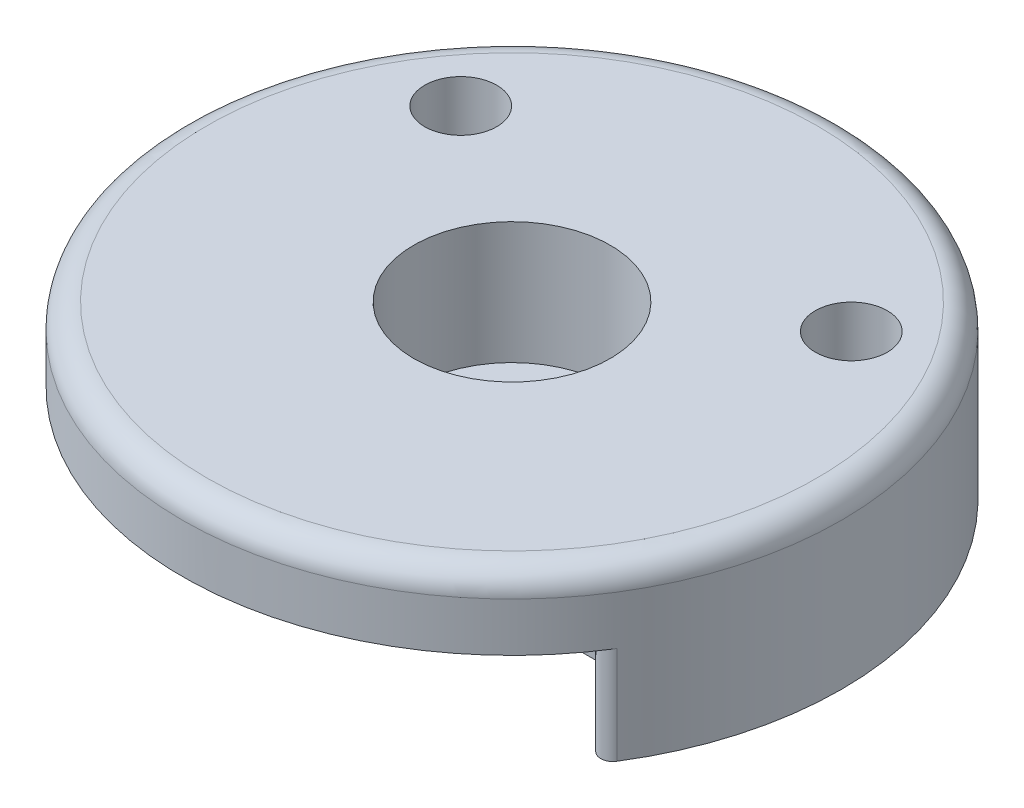
ISO-10303-21;
HEADER;
FILE_DESCRIPTION(('STEP AP214'),'2;1');
FILE_NAME('part.step','',(''),(''),'','','');
FILE_SCHEMA(('AUTOMOTIVE_DESIGN { 1 0 10303 214 1 1 1 1 }'));
ENDSEC;
DATA;
#1=APPLICATION_CONTEXT('core data for automotive mechanical design processes');
#2=APPLICATION_PROTOCOL_DEFINITION('international standard','automotive_design',2000,#1);
#3=PRODUCT_CONTEXT('',#1,'mechanical');
#4=PRODUCT('Part','Part','',(#3));
#5=PRODUCT_RELATED_PRODUCT_CATEGORY('part','',(#4));
#6=PRODUCT_DEFINITION_FORMATION('','',#4);
#7=PRODUCT_DEFINITION_CONTEXT('part definition',#1,'design');
#8=PRODUCT_DEFINITION('design','',#6,#7);
#9=PRODUCT_DEFINITION_SHAPE('','',#8);
#10=(LENGTH_UNIT() NAMED_UNIT(*) SI_UNIT(.MILLI.,.METRE.));
#11=(NAMED_UNIT(*) PLANE_ANGLE_UNIT() SI_UNIT($,.RADIAN.));
#12=(NAMED_UNIT(*) SI_UNIT($,.STERADIAN.) SOLID_ANGLE_UNIT());
#13=UNCERTAINTY_MEASURE_WITH_UNIT(LENGTH_MEASURE(1.E-05),#10,'distance_accuracy_value','');
#14=(GEOMETRIC_REPRESENTATION_CONTEXT(3) GLOBAL_UNCERTAINTY_ASSIGNED_CONTEXT((#13)) GLOBAL_UNIT_ASSIGNED_CONTEXT((#10,
#11,#12)) REPRESENTATION_CONTEXT('',''));
#15=CARTESIAN_POINT('',(0.,0.,0.));
#16=DIRECTION('',(0.,0.,1.));
#17=DIRECTION('',(1.,0.,0.));
#18=AXIS2_PLACEMENT_3D('',#15,#16,#17);
#19=CARTESIAN_POINT('',(0.,7.,0.));
#20=DIRECTION('',(0.,-1.,0.));
#21=DIRECTION('',(0.,0.,-1.));
#22=AXIS2_PLACEMENT_3D('',#19,#20,#21);
#23=CYLINDRICAL_SURFACE('',#22,13.5);
#24=CARTESIAN_POINT('',(0.,6.,0.));
#25=DIRECTION('',(0.,1.,0.));
#26=DIRECTION('',(0.,0.,1.));
#27=AXIS2_PLACEMENT_3D('',#24,#25,#26);
#28=CIRCLE('',#27,13.5);
#29=CARTESIAN_POINT('',(0.,6.,13.5));
#30=VERTEX_POINT('',#29);
#31=EDGE_CURVE('E191',#30,#30,#28,.F.);
#32=ORIENTED_EDGE('',*,*,#31,.T.);
#33=EDGE_LOOP('',(#32));
#34=FACE_BOUND('',#33,.T.);
#35=CARTESIAN_POINT('',(0.,4.,0.));
#36=DIRECTION('',(0.,-1.,0.));
#37=DIRECTION('',(0.,0.,-1.));
#38=AXIS2_PLACEMENT_3D('',#35,#36,#37);
#39=CIRCLE('',#38,13.5);
#40=CARTESIAN_POINT('',(11.4490384615385,4.,7.15328723778188));
#41=VERTEX_POINT('',#40);
#42=CARTESIAN_POINT('',(-11.4490384615385,4.,7.15328723778187));
#43=VERTEX_POINT('',#42);
#44=EDGE_CURVE('E198',#41,#43,#39,.T.);
#45=ORIENTED_EDGE('',*,*,#44,.F.);
#46=DIRECTION('',(0.,-1.,0.));
#47=VECTOR('',#46,1.);
#48=CARTESIAN_POINT('',(11.4490384615385,7.,7.15328723778188));
#49=LINE('',#48,#47);
#50=CARTESIAN_POINT('',(11.4490384615385,0.,7.15328723778188));
#51=VERTEX_POINT('',#50);
#52=EDGE_CURVE('E209',#41,#51,#49,.T.);
#53=ORIENTED_EDGE('',*,*,#52,.T.);
#54=CARTESIAN_POINT('',(0.,0.,0.));
#55=DIRECTION('',(0.,1.,0.));
#56=DIRECTION('',(0.,0.,1.));
#57=AXIS2_PLACEMENT_3D('',#54,#55,#56);
#58=CIRCLE('',#57,13.5);
#59=CARTESIAN_POINT('',(-11.4490384615385,0.,7.15328723778187));
#60=VERTEX_POINT('',#59);
#61=EDGE_CURVE('E180',#51,#60,#58,.T.);
#62=ORIENTED_EDGE('',*,*,#61,.T.);
#63=DIRECTION('',(0.,-1.,0.));
#64=VECTOR('',#63,1.);
#65=CARTESIAN_POINT('',(-11.4490384615385,7.,7.15328723778187));
#66=LINE('',#65,#64);
#67=EDGE_CURVE('E205',#60,#43,#66,.F.);
#68=ORIENTED_EDGE('',*,*,#67,.T.);
#69=EDGE_LOOP('',(#45,#53,#62,#68));
#70=FACE_BOUND('',#69,.T.);
#71=ADVANCED_FACE('F39',(#34,#70),#23,.T.);
#72=CARTESIAN_POINT('',(0.,0.,0.));
#73=DIRECTION('',(0.,1.,0.));
#74=DIRECTION('',(0.,0.,1.));
#75=AXIS2_PLACEMENT_3D('',#72,#73,#74);
#76=PLANE('',#75);
#77=ORIENTED_EDGE('',*,*,#61,.F.);
#78=CARTESIAN_POINT('',(11.025,0.,6.88835067341958));
#79=DIRECTION('',(0.,1.,0.));
#80=DIRECTION('',(0.,0.,1.));
#81=AXIS2_PLACEMENT_3D('',#78,#79,#80);
#82=CIRCLE('',#81,0.5);
#83=CARTESIAN_POINT('',(10.525,0.,6.88835067341958));
#84=VERTEX_POINT('',#83);
#85=EDGE_CURVE('E214',#51,#84,#82,.F.);
#86=ORIENTED_EDGE('',*,*,#85,.T.);
#87=DIRECTION('',(0.,0.,1.));
#88=VECTOR('',#87,1.);
#89=CARTESIAN_POINT('',(10.525,0.,7.85));
#90=LINE('',#89,#88);
#91=CARTESIAN_POINT('',(10.525,0.,-7.85));
#92=VERTEX_POINT('',#91);
#93=EDGE_CURVE('E141',#92,#84,#90,.T.);
#94=ORIENTED_EDGE('',*,*,#93,.F.);
#95=DIRECTION('',(1.,0.,0.));
#96=VECTOR('',#95,1.);
#97=CARTESIAN_POINT('',(-10.525,0.,-7.85));
#98=LINE('',#97,#96);
#99=CARTESIAN_POINT('',(-10.525,0.,-7.85));
#100=VERTEX_POINT('',#99);
#101=EDGE_CURVE('E152',#100,#92,#98,.T.);
#102=ORIENTED_EDGE('',*,*,#101,.F.);
#103=DIRECTION('',(0.,0.,-1.));
#104=VECTOR('',#103,1.);
#105=CARTESIAN_POINT('',(-10.525,0.,7.85));
#106=LINE('',#105,#104);
#107=CARTESIAN_POINT('',(-10.525,0.,6.88835067341958));
#108=VERTEX_POINT('',#107);
#109=EDGE_CURVE('E163',#108,#100,#106,.T.);
#110=ORIENTED_EDGE('',*,*,#109,.F.);
#111=CARTESIAN_POINT('',(-11.025,0.,6.88835067341958));
#112=DIRECTION('',(0.,1.,0.));
#113=DIRECTION('',(0.,0.,1.));
#114=AXIS2_PLACEMENT_3D('',#111,#112,#113);
#115=CIRCLE('',#114,0.5);
#116=EDGE_CURVE('E61',#108,#60,#115,.F.);
#117=ORIENTED_EDGE('',*,*,#116,.T.);
#118=EDGE_LOOP('',(#77,#86,#94,#102,#110,#117));
#119=FACE_BOUND('',#118,.T.);
#120=ADVANCED_FACE('F229',(#119),#76,.F.);
#121=CARTESIAN_POINT('',(0.,1.,0.));
#122=DIRECTION('',(0.,-1.,0.));
#123=DIRECTION('',(0.,0.,-1.));
#124=AXIS2_PLACEMENT_3D('',#121,#122,#123);
#125=PLANE('',#124);
#126=CARTESIAN_POINT('',(-8.,1.,-5.9));
#127=DIRECTION('',(0.,-1.,0.));
#128=DIRECTION('',(0.,0.,-1.));
#129=AXIS2_PLACEMENT_3D('',#126,#127,#128);
#130=CIRCLE('',#129,1.475);
#131=CARTESIAN_POINT('',(-8.,1.,-7.375));
#132=VERTEX_POINT('',#131);
#133=EDGE_CURVE('E132',#132,#132,#130,.T.);
#134=ORIENTED_EDGE('',*,*,#133,.F.);
#135=EDGE_LOOP('',(#134));
#136=FACE_BOUND('',#135,.T.);
#137=CARTESIAN_POINT('',(8.,1.,-5.9));
#138=DIRECTION('',(0.,-1.,0.));
#139=DIRECTION('',(0.,0.,-1.));
#140=AXIS2_PLACEMENT_3D('',#137,#138,#139);
#141=CIRCLE('',#140,1.475);
#142=CARTESIAN_POINT('',(8.,1.,-7.375));
#143=VERTEX_POINT('',#142);
#144=EDGE_CURVE('E121',#143,#143,#141,.T.);
#145=ORIENTED_EDGE('',*,*,#144,.F.);
#146=EDGE_LOOP('',(#145));
#147=FACE_BOUND('',#146,.T.);
#148=DIRECTION('',(0.,0.,1.));
#149=VECTOR('',#148,1.);
#150=CARTESIAN_POINT('',(10.525,1.,7.85));
#151=LINE('',#150,#149);
#152=CARTESIAN_POINT('',(10.525,1.,-7.85));
#153=VERTEX_POINT('',#152);
#154=CARTESIAN_POINT('',(10.525,1.,5.));
#155=VERTEX_POINT('',#154);
#156=EDGE_CURVE('E148',#153,#155,#151,.T.);
#157=ORIENTED_EDGE('',*,*,#156,.T.);
#158=DIRECTION('',(-1.,0.,0.));
#159=VECTOR('',#158,1.);
#160=CARTESIAN_POINT('',(0.,1.,5.));
#161=LINE('',#160,#159);
#162=CARTESIAN_POINT('',(-10.525,1.,5.));
#163=VERTEX_POINT('',#162);
#164=EDGE_CURVE('E195',#155,#163,#161,.T.);
#165=ORIENTED_EDGE('',*,*,#164,.T.);
#166=DIRECTION('',(0.,0.,-1.));
#167=VECTOR('',#166,1.);
#168=CARTESIAN_POINT('',(-10.525,1.,7.85));
#169=LINE('',#168,#167);
#170=CARTESIAN_POINT('',(-10.525,1.,-7.85));
#171=VERTEX_POINT('',#170);
#172=EDGE_CURVE('E116',#163,#171,#169,.T.);
#173=ORIENTED_EDGE('',*,*,#172,.T.);
#174=DIRECTION('',(1.,0.,0.));
#175=VECTOR('',#174,1.);
#176=CARTESIAN_POINT('',(-10.525,1.,-7.85));
#177=LINE('',#176,#175);
#178=EDGE_CURVE('E155',#171,#153,#177,.T.);
#179=ORIENTED_EDGE('',*,*,#178,.T.);
#180=EDGE_LOOP('',(#157,#165,#173,#179));
#181=FACE_BOUND('',#180,.T.);
#182=ADVANCED_FACE('F238',(#136,#147,#181),#125,.T.);
#183=CARTESIAN_POINT('',(0.,7.,0.));
#184=DIRECTION('',(0.,1.,0.));
#185=DIRECTION('',(0.,0.,1.));
#186=AXIS2_PLACEMENT_3D('',#183,#184,#185);
#187=PLANE('',#186);
#188=CARTESIAN_POINT('',(0.,7.,0.));
#189=DIRECTION('',(0.,1.,0.));
#190=DIRECTION('',(0.,0.,1.));
#191=AXIS2_PLACEMENT_3D('',#188,#189,#190);
#192=CIRCLE('',#191,12.5);
#193=CARTESIAN_POINT('',(0.,7.,12.5));
#194=VERTEX_POINT('',#193);
#195=EDGE_CURVE('E187',#194,#194,#192,.T.);
#196=ORIENTED_EDGE('',*,*,#195,.T.);
#197=EDGE_LOOP('',(#196));
#198=FACE_BOUND('',#197,.T.);
#199=CARTESIAN_POINT('',(-8.,7.,-5.9));
#200=DIRECTION('',(0.,1.,0.));
#201=DIRECTION('',(0.,0.,1.));
#202=AXIS2_PLACEMENT_3D('',#199,#200,#201);
#203=CIRCLE('',#202,1.475);
#204=CARTESIAN_POINT('',(-8.,7.,-4.425));
#205=VERTEX_POINT('',#204);
#206=EDGE_CURVE('E136',#205,#205,#203,.F.);
#207=ORIENTED_EDGE('',*,*,#206,.T.);
#208=EDGE_LOOP('',(#207));
#209=FACE_BOUND('',#208,.T.);
#210=CARTESIAN_POINT('',(8.,7.,-5.9));
#211=DIRECTION('',(0.,1.,0.));
#212=DIRECTION('',(0.,0.,1.));
#213=AXIS2_PLACEMENT_3D('',#210,#211,#212);
#214=CIRCLE('',#213,1.475);
#215=CARTESIAN_POINT('',(8.,7.,-4.425));
#216=VERTEX_POINT('',#215);
#217=EDGE_CURVE('E137',#216,#216,#214,.F.);
#218=ORIENTED_EDGE('',*,*,#217,.T.);
#219=EDGE_LOOP('',(#218));
#220=FACE_BOUND('',#219,.T.);
#221=CARTESIAN_POINT('',(0.,7.,0.));
#222=DIRECTION('',(0.,1.,0.));
#223=DIRECTION('',(0.,0.,1.));
#224=AXIS2_PLACEMENT_3D('',#221,#222,#223);
#225=CIRCLE('',#224,4.025);
#226=CARTESIAN_POINT('',(0.,7.,4.025));
#227=VERTEX_POINT('',#226);
#228=EDGE_CURVE('E172',#227,#227,#225,.T.);
#229=ORIENTED_EDGE('',*,*,#228,.F.);
#230=EDGE_LOOP('',(#229));
#231=FACE_BOUND('',#230,.T.);
#232=ADVANCED_FACE('F286',(#198,#209,#220,#231),#187,.T.);
#233=CARTESIAN_POINT('',(0.,2.,0.));
#234=DIRECTION('',(0.,1.,0.));
#235=DIRECTION('',(0.,0.,1.));
#236=AXIS2_PLACEMENT_3D('',#233,#234,#235);
#237=CYLINDRICAL_SURFACE('',#236,4.025);
#238=CARTESIAN_POINT('',(0.,2.,0.));
#239=DIRECTION('',(0.,1.,0.));
#240=DIRECTION('',(0.,0.,1.));
#241=AXIS2_PLACEMENT_3D('',#238,#239,#240);
#242=CIRCLE('',#241,4.025);
#243=CARTESIAN_POINT('',(0.,2.,4.025));
#244=VERTEX_POINT('',#243);
#245=EDGE_CURVE('E176',#244,#244,#242,.T.);
#246=ORIENTED_EDGE('',*,*,#245,.F.);
#247=EDGE_LOOP('',(#246));
#248=FACE_BOUND('',#247,.T.);
#249=ORIENTED_EDGE('',*,*,#228,.T.);
#250=EDGE_LOOP('',(#249));
#251=FACE_BOUND('',#250,.T.);
#252=ADVANCED_FACE('F250',(#248,#251),#237,.F.);
#253=CARTESIAN_POINT('',(0.,2.,0.));
#254=DIRECTION('',(0.,1.,0.));
#255=DIRECTION('',(0.,0.,1.));
#256=AXIS2_PLACEMENT_3D('',#253,#254,#255);
#257=PLANE('',#256);
#258=ORIENTED_EDGE('',*,*,#245,.T.);
#259=EDGE_LOOP('',(#258));
#260=FACE_BOUND('',#259,.T.);
#261=ADVANCED_FACE('F243',(#260),#257,.T.);
#262=CARTESIAN_POINT('',(10.525,1.,7.85));
#263=DIRECTION('',(1.,0.,0.));
#264=DIRECTION('',(0.,0.,-1.));
#265=AXIS2_PLACEMENT_3D('',#262,#263,#264);
#266=PLANE('',#265);
#267=ORIENTED_EDGE('',*,*,#93,.T.);
#268=DIRECTION('',(0.,-1.,0.));
#269=VECTOR('',#268,1.);
#270=CARTESIAN_POINT('',(10.525,1.,6.88835067341958));
#271=LINE('',#270,#269);
#272=CARTESIAN_POINT('',(10.525,4.,6.88835067341958));
#273=VERTEX_POINT('',#272);
#274=EDGE_CURVE('E201',#84,#273,#271,.F.);
#275=ORIENTED_EDGE('',*,*,#274,.T.);
#276=DIRECTION('',(0.,0.,1.));
#277=VECTOR('',#276,1.);
#278=CARTESIAN_POINT('',(10.525,4.,5.));
#279=LINE('',#278,#277);
#280=CARTESIAN_POINT('',(10.525,4.,5.));
#281=VERTEX_POINT('',#280);
#282=EDGE_CURVE('E110',#281,#273,#279,.T.);
#283=ORIENTED_EDGE('',*,*,#282,.F.);
#284=DIRECTION('',(0.,1.,0.));
#285=VECTOR('',#284,1.);
#286=CARTESIAN_POINT('',(10.525,-22.7013766102411,5.));
#287=LINE('',#286,#285);
#288=EDGE_CURVE('E122',#155,#281,#287,.T.);
#289=ORIENTED_EDGE('',*,*,#288,.F.);
#290=ORIENTED_EDGE('',*,*,#156,.F.);
#291=DIRECTION('',(0.,-1.,0.));
#292=VECTOR('',#291,1.);
#293=CARTESIAN_POINT('',(10.525,1.,-7.85));
#294=LINE('',#293,#292);
#295=EDGE_CURVE('E169',#153,#92,#294,.T.);
#296=ORIENTED_EDGE('',*,*,#295,.T.);
#297=EDGE_LOOP('',(#267,#275,#283,#289,#290,#296));
#298=FACE_BOUND('',#297,.T.);
#299=ADVANCED_FACE('F240',(#298),#266,.F.);
#300=CARTESIAN_POINT('',(-10.525,1.,-7.85));
#301=DIRECTION('',(0.,0.,-1.));
#302=DIRECTION('',(-1.,0.,0.));
#303=AXIS2_PLACEMENT_3D('',#300,#301,#302);
#304=PLANE('',#303);
#305=ORIENTED_EDGE('',*,*,#101,.T.);
#306=ORIENTED_EDGE('',*,*,#295,.F.);
#307=ORIENTED_EDGE('',*,*,#178,.F.);
#308=DIRECTION('',(0.,-1.,0.));
#309=VECTOR('',#308,1.);
#310=CARTESIAN_POINT('',(-10.525,1.,-7.85));
#311=LINE('',#310,#309);
#312=EDGE_CURVE('E159',#171,#100,#311,.T.);
#313=ORIENTED_EDGE('',*,*,#312,.T.);
#314=EDGE_LOOP('',(#305,#306,#307,#313));
#315=FACE_BOUND('',#314,.T.);
#316=ADVANCED_FACE('F235',(#315),#304,.F.);
#317=CARTESIAN_POINT('',(-10.525,1.,7.85));
#318=DIRECTION('',(-1.,0.,0.));
#319=DIRECTION('',(0.,0.,1.));
#320=AXIS2_PLACEMENT_3D('',#317,#318,#319);
#321=PLANE('',#320);
#322=DIRECTION('',(0.,0.,-1.));
#323=VECTOR('',#322,1.);
#324=CARTESIAN_POINT('',(-10.525,4.,5.));
#325=LINE('',#324,#323);
#326=CARTESIAN_POINT('',(-10.525,4.,6.88835067341958));
#327=VERTEX_POINT('',#326);
#328=CARTESIAN_POINT('',(-10.525,4.,5.));
#329=VERTEX_POINT('',#328);
#330=EDGE_CURVE('E102',#327,#329,#325,.T.);
#331=ORIENTED_EDGE('',*,*,#330,.F.);
#332=DIRECTION('',(0.,-1.,0.));
#333=VECTOR('',#332,1.);
#334=CARTESIAN_POINT('',(-10.525,1.,6.88835067341958));
#335=LINE('',#334,#333);
#336=EDGE_CURVE('E217',#327,#108,#335,.T.);
#337=ORIENTED_EDGE('',*,*,#336,.T.);
#338=ORIENTED_EDGE('',*,*,#109,.T.);
#339=ORIENTED_EDGE('',*,*,#312,.F.);
#340=ORIENTED_EDGE('',*,*,#172,.F.);
#341=DIRECTION('',(0.,1.,0.));
#342=VECTOR('',#341,1.);
#343=CARTESIAN_POINT('',(-10.525,-22.7013766102411,5.));
#344=LINE('',#343,#342);
#345=EDGE_CURVE('E113',#163,#329,#344,.T.);
#346=ORIENTED_EDGE('',*,*,#345,.T.);
#347=EDGE_LOOP('',(#331,#337,#338,#339,#340,#346));
#348=FACE_BOUND('',#347,.T.);
#349=ADVANCED_FACE('F114',(#348),#321,.F.);
#350=CARTESIAN_POINT('',(8.,11.1719300090006,-5.9));
#351=DIRECTION('',(0.,-1.,0.));
#352=DIRECTION('',(0.,0.,-1.));
#353=AXIS2_PLACEMENT_3D('',#350,#351,#352);
#354=CYLINDRICAL_SURFACE('',#353,1.475);
#355=ORIENTED_EDGE('',*,*,#144,.T.);
#356=EDGE_LOOP('',(#355));
#357=FACE_BOUND('',#356,.T.);
#358=ORIENTED_EDGE('',*,*,#217,.F.);
#359=EDGE_LOOP('',(#358));
#360=FACE_BOUND('',#359,.T.);
#361=ADVANCED_FACE('F280',(#357,#360),#354,.F.);
#362=CARTESIAN_POINT('',(-8.,11.1719300090006,-5.9));
#363=DIRECTION('',(0.,-1.,0.));
#364=DIRECTION('',(0.,0.,-1.));
#365=AXIS2_PLACEMENT_3D('',#362,#363,#364);
#366=CYLINDRICAL_SURFACE('',#365,1.475);
#367=ORIENTED_EDGE('',*,*,#133,.T.);
#368=EDGE_LOOP('',(#367));
#369=FACE_BOUND('',#368,.T.);
#370=ORIENTED_EDGE('',*,*,#206,.F.);
#371=EDGE_LOOP('',(#370));
#372=FACE_BOUND('',#371,.T.);
#373=ADVANCED_FACE('F265',(#369,#372),#366,.F.);
#374=CARTESIAN_POINT('',(0.,6.,0.));
#375=DIRECTION('',(0.,1.,0.));
#376=DIRECTION('',(0.,0.,1.));
#377=AXIS2_PLACEMENT_3D('',#374,#375,#376);
#378=TOROIDAL_SURFACE('',#377,12.5,1.);
#379=ORIENTED_EDGE('',*,*,#31,.F.);
#380=EDGE_LOOP('',(#379));
#381=FACE_BOUND('',#380,.T.);
#382=ORIENTED_EDGE('',*,*,#195,.F.);
#383=EDGE_LOOP('',(#382));
#384=FACE_BOUND('',#383,.T.);
#385=ADVANCED_FACE('F263',(#381,#384),#378,.T.);
#386=CARTESIAN_POINT('',(0.,4.,0.));
#387=DIRECTION('',(0.,-1.,0.));
#388=DIRECTION('',(0.,0.,-1.));
#389=AXIS2_PLACEMENT_3D('',#386,#387,#388);
#390=PLANE('',#389);
#391=ORIENTED_EDGE('',*,*,#282,.T.);
#392=CARTESIAN_POINT('',(11.025,4.,6.88835067341958));
#393=DIRECTION('',(0.,-1.,0.));
#394=DIRECTION('',(0.,0.,-1.));
#395=AXIS2_PLACEMENT_3D('',#392,#393,#394);
#396=CIRCLE('',#395,0.5);
#397=EDGE_CURVE('E48',#273,#41,#396,.F.);
#398=ORIENTED_EDGE('',*,*,#397,.T.);
#399=ORIENTED_EDGE('',*,*,#44,.T.);
#400=CARTESIAN_POINT('',(-11.025,4.,6.88835067341958));
#401=DIRECTION('',(0.,-1.,0.));
#402=DIRECTION('',(0.,0.,-1.));
#403=AXIS2_PLACEMENT_3D('',#400,#401,#402);
#404=CIRCLE('',#403,0.5);
#405=EDGE_CURVE('E11',#43,#327,#404,.F.);
#406=ORIENTED_EDGE('',*,*,#405,.T.);
#407=ORIENTED_EDGE('',*,*,#330,.T.);
#408=DIRECTION('',(1.,0.,0.));
#409=VECTOR('',#408,1.);
#410=CARTESIAN_POINT('',(10.525,4.,5.));
#411=LINE('',#410,#409);
#412=EDGE_CURVE('E107',#329,#281,#411,.T.);
#413=ORIENTED_EDGE('',*,*,#412,.T.);
#414=EDGE_LOOP('',(#391,#398,#399,#406,#407,#413));
#415=FACE_BOUND('',#414,.T.);
#416=ADVANCED_FACE('F105',(#415),#390,.T.);
#417=CARTESIAN_POINT('',(10.525,-22.7013766102411,5.));
#418=DIRECTION('',(0.,0.,1.));
#419=DIRECTION('',(1.,0.,0.));
#420=AXIS2_PLACEMENT_3D('',#417,#418,#419);
#421=PLANE('',#420);
#422=ORIENTED_EDGE('',*,*,#288,.T.);
#423=ORIENTED_EDGE('',*,*,#412,.F.);
#424=ORIENTED_EDGE('',*,*,#345,.F.);
#425=ORIENTED_EDGE('',*,*,#164,.F.);
#426=EDGE_LOOP('',(#422,#423,#424,#425));
#427=FACE_BOUND('',#426,.T.);
#428=ADVANCED_FACE('F124',(#427),#421,.T.);
#429=CARTESIAN_POINT('',(11.025,7.,6.88835067341958));
#430=DIRECTION('',(0.,-1.,0.));
#431=DIRECTION('',(0.,0.,-1.));
#432=AXIS2_PLACEMENT_3D('',#429,#430,#431);
#433=CYLINDRICAL_SURFACE('',#432,0.5);
#434=ORIENTED_EDGE('',*,*,#85,.F.);
#435=ORIENTED_EDGE('',*,*,#52,.F.);
#436=ORIENTED_EDGE('',*,*,#397,.F.);
#437=ORIENTED_EDGE('',*,*,#274,.F.);
#438=EDGE_LOOP('',(#434,#435,#436,#437));
#439=FACE_BOUND('',#438,.T.);
#440=ADVANCED_FACE('F225',(#439),#433,.T.);
#441=CARTESIAN_POINT('',(-11.025,7.,6.88835067341958));
#442=DIRECTION('',(0.,-1.,0.));
#443=DIRECTION('',(0.,0.,-1.));
#444=AXIS2_PLACEMENT_3D('',#441,#442,#443);
#445=CYLINDRICAL_SURFACE('',#444,0.5);
#446=ORIENTED_EDGE('',*,*,#405,.F.);
#447=ORIENTED_EDGE('',*,*,#67,.F.);
#448=ORIENTED_EDGE('',*,*,#116,.F.);
#449=ORIENTED_EDGE('',*,*,#336,.F.);
#450=EDGE_LOOP('',(#446,#447,#448,#449));
#451=FACE_BOUND('',#450,.T.);
#452=ADVANCED_FACE('F41',(#451),#445,.T.);
#453=CLOSED_SHELL('',(#71,#120,#182,#232,#252,#261,#299,#316,#349,#361,#373,#385,#416,#428,#440,#452));
#454=MANIFOLD_SOLID_BREP('B2',#453);
#455=ADVANCED_BREP_SHAPE_REPRESENTATION('',(#18,#454),#14);
#456=SHAPE_DEFINITION_REPRESENTATION(#9,#455);
ENDSEC;
END-ISO-10303-21;
